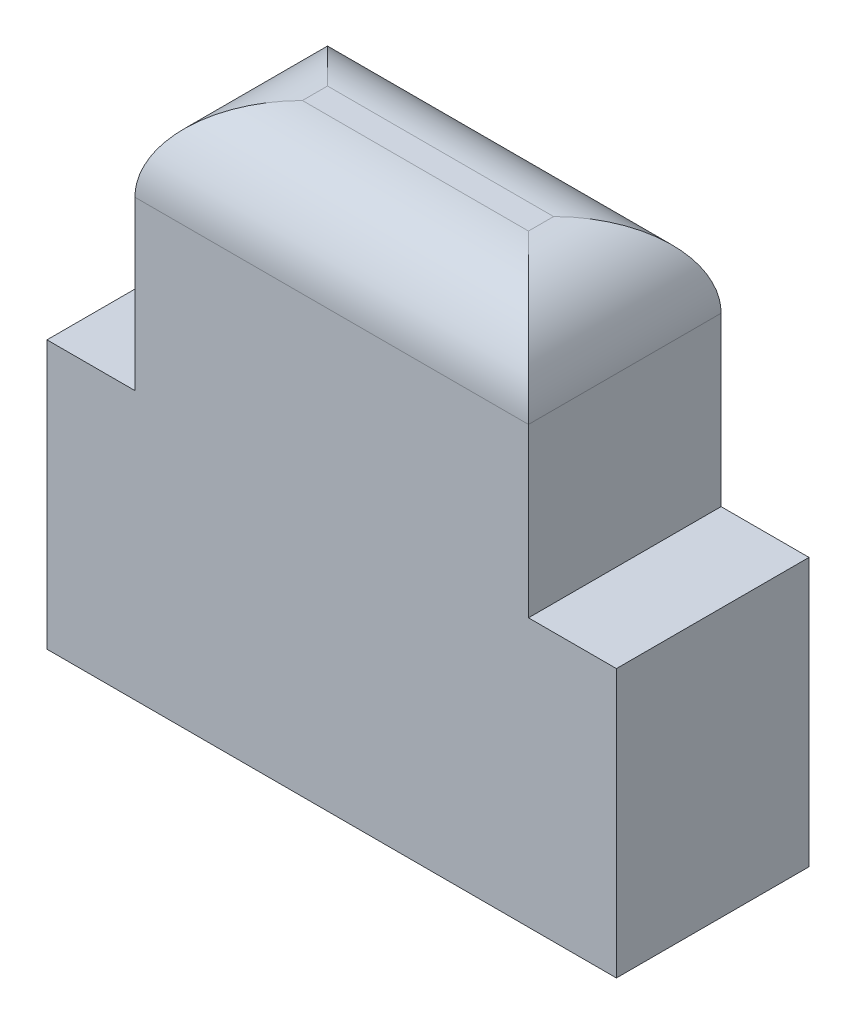
ISO-10303-21;
HEADER;
FILE_DESCRIPTION(('STEP AP214'),'2;1');
FILE_NAME('part.step','',(''),(''),'','','');
FILE_SCHEMA(('AUTOMOTIVE_DESIGN { 1 0 10303 214 1 1 1 1 }'));
ENDSEC;
DATA;
#1=APPLICATION_CONTEXT('core data for automotive mechanical design processes');
#2=APPLICATION_PROTOCOL_DEFINITION('international standard','automotive_design',2000,#1);
#3=PRODUCT_CONTEXT('',#1,'mechanical');
#4=PRODUCT('Part','Part','',(#3));
#5=PRODUCT_RELATED_PRODUCT_CATEGORY('part','',(#4));
#6=PRODUCT_DEFINITION_FORMATION('','',#4);
#7=PRODUCT_DEFINITION_CONTEXT('part definition',#1,'design');
#8=PRODUCT_DEFINITION('design','',#6,#7);
#9=PRODUCT_DEFINITION_SHAPE('','',#8);
#10=(LENGTH_UNIT() NAMED_UNIT(*) SI_UNIT(.MILLI.,.METRE.));
#11=(NAMED_UNIT(*) PLANE_ANGLE_UNIT() SI_UNIT($,.RADIAN.));
#12=(NAMED_UNIT(*) SI_UNIT($,.STERADIAN.) SOLID_ANGLE_UNIT());
#13=UNCERTAINTY_MEASURE_WITH_UNIT(LENGTH_MEASURE(1.E-05),#10,'distance_accuracy_value','');
#14=(GEOMETRIC_REPRESENTATION_CONTEXT(3) GLOBAL_UNCERTAINTY_ASSIGNED_CONTEXT((#13)) GLOBAL_UNIT_ASSIGNED_CONTEXT((#10,
#11,#12)) REPRESENTATION_CONTEXT('',''));
#15=CARTESIAN_POINT('',(0.,0.,0.));
#16=DIRECTION('',(0.,0.,1.));
#17=DIRECTION('',(1.,0.,0.));
#18=AXIS2_PLACEMENT_3D('',#15,#16,#17);
#19=CARTESIAN_POINT('',(0.,3.2,0.));
#20=DIRECTION('',(0.,1.,0.));
#21=DIRECTION('',(0.,0.,1.));
#22=AXIS2_PLACEMENT_3D('',#19,#20,#21);
#23=PLANE('',#22);
#24=DIRECTION('',(0.,0.,-1.));
#25=VECTOR('',#24,1.);
#26=CARTESIAN_POINT('',(2.35,3.2,1.15));
#27=LINE('',#26,#25);
#28=CARTESIAN_POINT('',(2.35,3.2,1.15));
#29=VERTEX_POINT('',#28);
#30=CARTESIAN_POINT('',(2.35,3.2,-1.15));
#31=VERTEX_POINT('',#30);
#32=EDGE_CURVE('E135',#29,#31,#27,.T.);
#33=ORIENTED_EDGE('',*,*,#32,.F.);
#34=DIRECTION('',(1.,0.,0.));
#35=VECTOR('',#34,1.);
#36=CARTESIAN_POINT('',(-3.4,3.2,1.15));
#37=LINE('',#36,#35);
#38=CARTESIAN_POINT('',(3.4,3.2,1.15));
#39=VERTEX_POINT('',#38);
#40=EDGE_CURVE('E131',#29,#39,#37,.T.);
#41=ORIENTED_EDGE('',*,*,#40,.T.);
#42=DIRECTION('',(0.,0.,-1.));
#43=VECTOR('',#42,1.);
#44=CARTESIAN_POINT('',(3.4,3.2,-1.15));
#45=LINE('',#44,#43);
#46=CARTESIAN_POINT('',(3.4,3.2,-1.15));
#47=VERTEX_POINT('',#46);
#48=EDGE_CURVE('E145',#39,#47,#45,.T.);
#49=ORIENTED_EDGE('',*,*,#48,.T.);
#50=DIRECTION('',(-1.,0.,0.));
#51=VECTOR('',#50,1.);
#52=CARTESIAN_POINT('',(-3.4,3.2,-1.15));
#53=LINE('',#52,#51);
#54=EDGE_CURVE('E150',#47,#31,#53,.T.);
#55=ORIENTED_EDGE('',*,*,#54,.T.);
#56=EDGE_LOOP('',(#33,#41,#49,#55));
#57=FACE_BOUND('',#56,.T.);
#58=ADVANCED_FACE('F35',(#57),#23,.T.);
#59=CARTESIAN_POINT('',(3.4,3.2,-1.15));
#60=DIRECTION('',(-1.,0.,0.));
#61=DIRECTION('',(0.,0.,1.));
#62=AXIS2_PLACEMENT_3D('',#59,#60,#61);
#63=PLANE('',#62);
#64=DIRECTION('',(0.,0.,-1.));
#65=VECTOR('',#64,1.);
#66=CARTESIAN_POINT('',(3.4,0.,-1.15));
#67=LINE('',#66,#65);
#68=CARTESIAN_POINT('',(3.4,0.,1.15));
#69=VERTEX_POINT('',#68);
#70=CARTESIAN_POINT('',(3.4,0.,-1.15));
#71=VERTEX_POINT('',#70);
#72=EDGE_CURVE('E144',#69,#71,#67,.T.);
#73=ORIENTED_EDGE('',*,*,#72,.T.);
#74=DIRECTION('',(0.,-1.,0.));
#75=VECTOR('',#74,1.);
#76=CARTESIAN_POINT('',(3.4,3.2,-1.15));
#77=LINE('',#76,#75);
#78=EDGE_CURVE('E168',#47,#71,#77,.T.);
#79=ORIENTED_EDGE('',*,*,#78,.F.);
#80=ORIENTED_EDGE('',*,*,#48,.F.);
#81=DIRECTION('',(0.,-1.,0.));
#82=VECTOR('',#81,1.);
#83=CARTESIAN_POINT('',(3.4,3.2,1.15));
#84=LINE('',#83,#82);
#85=EDGE_CURVE('E130',#39,#69,#84,.T.);
#86=ORIENTED_EDGE('',*,*,#85,.T.);
#87=EDGE_LOOP('',(#73,#79,#80,#86));
#88=FACE_BOUND('',#87,.T.);
#89=ADVANCED_FACE('F221',(#88),#63,.F.);
#90=CARTESIAN_POINT('',(-3.4,3.2,-1.15));
#91=DIRECTION('',(0.,0.,1.));
#92=DIRECTION('',(1.,0.,0.));
#93=AXIS2_PLACEMENT_3D('',#90,#91,#92);
#94=PLANE('',#93);
#95=DIRECTION('',(0.,-1.,0.));
#96=VECTOR('',#95,1.);
#97=CARTESIAN_POINT('',(-2.35,6.2,-1.15));
#98=LINE('',#97,#96);
#99=CARTESIAN_POINT('',(-2.35,5.2,-1.15));
#100=VERTEX_POINT('',#99);
#101=CARTESIAN_POINT('',(-2.35,3.2,-1.15));
#102=VERTEX_POINT('',#101);
#103=EDGE_CURVE('E119',#100,#102,#98,.T.);
#104=ORIENTED_EDGE('',*,*,#103,.F.);
#105=DIRECTION('',(-1.,0.,0.));
#106=VECTOR('',#105,1.);
#107=CARTESIAN_POINT('',(-3.4,5.2,-1.15));
#108=LINE('',#107,#106);
#109=CARTESIAN_POINT('',(2.35,5.2,-1.15));
#110=VERTEX_POINT('',#109);
#111=EDGE_CURVE('E180',#100,#110,#108,.F.);
#112=ORIENTED_EDGE('',*,*,#111,.T.);
#113=DIRECTION('',(0.,-1.,0.));
#114=VECTOR('',#113,1.);
#115=CARTESIAN_POINT('',(2.35,6.2,-1.15));
#116=LINE('',#115,#114);
#117=EDGE_CURVE('E142',#110,#31,#116,.T.);
#118=ORIENTED_EDGE('',*,*,#117,.T.);
#119=ORIENTED_EDGE('',*,*,#54,.F.);
#120=ORIENTED_EDGE('',*,*,#78,.T.);
#121=DIRECTION('',(-1.,0.,0.));
#122=VECTOR('',#121,1.);
#123=CARTESIAN_POINT('',(-3.4,0.,-1.15));
#124=LINE('',#123,#122);
#125=CARTESIAN_POINT('',(-3.4,0.,-1.15));
#126=VERTEX_POINT('',#125);
#127=EDGE_CURVE('E156',#71,#126,#124,.T.);
#128=ORIENTED_EDGE('',*,*,#127,.T.);
#129=DIRECTION('',(0.,-1.,0.));
#130=VECTOR('',#129,1.);
#131=CARTESIAN_POINT('',(-3.4,3.2,-1.15));
#132=LINE('',#131,#130);
#133=CARTESIAN_POINT('',(-3.4,3.2,-1.15));
#134=VERTEX_POINT('',#133);
#135=EDGE_CURVE('E165',#134,#126,#132,.T.);
#136=ORIENTED_EDGE('',*,*,#135,.F.);
#137=EDGE_CURVE('E148',#102,#134,#53,.T.);
#138=ORIENTED_EDGE('',*,*,#137,.F.);
#139=EDGE_LOOP('',(#104,#112,#118,#119,#120,#128,#136,#138));
#140=FACE_BOUND('',#139,.T.);
#141=ADVANCED_FACE('F205',(#140),#94,.F.);
#142=CARTESIAN_POINT('',(-3.4,3.2,-1.15));
#143=DIRECTION('',(1.,0.,0.));
#144=DIRECTION('',(0.,0.,-1.));
#145=AXIS2_PLACEMENT_3D('',#142,#143,#144);
#146=PLANE('',#145);
#147=DIRECTION('',(0.,0.,1.));
#148=VECTOR('',#147,1.);
#149=CARTESIAN_POINT('',(-3.4,0.,-1.15));
#150=LINE('',#149,#148);
#151=CARTESIAN_POINT('',(-3.4,0.,1.15));
#152=VERTEX_POINT('',#151);
#153=EDGE_CURVE('E158',#126,#152,#150,.T.);
#154=ORIENTED_EDGE('',*,*,#153,.T.);
#155=DIRECTION('',(0.,-1.,0.));
#156=VECTOR('',#155,1.);
#157=CARTESIAN_POINT('',(-3.4,3.2,1.15));
#158=LINE('',#157,#156);
#159=CARTESIAN_POINT('',(-3.4,3.2,1.15));
#160=VERTEX_POINT('',#159);
#161=EDGE_CURVE('E163',#160,#152,#158,.T.);
#162=ORIENTED_EDGE('',*,*,#161,.F.);
#163=DIRECTION('',(0.,0.,1.));
#164=VECTOR('',#163,1.);
#165=CARTESIAN_POINT('',(-3.4,3.2,-1.15));
#166=LINE('',#165,#164);
#167=EDGE_CURVE('E128',#134,#160,#166,.T.);
#168=ORIENTED_EDGE('',*,*,#167,.F.);
#169=ORIENTED_EDGE('',*,*,#135,.T.);
#170=EDGE_LOOP('',(#154,#162,#168,#169));
#171=FACE_BOUND('',#170,.T.);
#172=ADVANCED_FACE('F239',(#171),#146,.F.);
#173=CARTESIAN_POINT('',(-3.4,3.2,1.15));
#174=DIRECTION('',(0.,0.,-1.));
#175=DIRECTION('',(-1.,0.,0.));
#176=AXIS2_PLACEMENT_3D('',#173,#174,#175);
#177=PLANE('',#176);
#178=DIRECTION('',(0.,-1.,0.));
#179=VECTOR('',#178,1.);
#180=CARTESIAN_POINT('',(2.35,6.2,1.15));
#181=LINE('',#180,#179);
#182=CARTESIAN_POINT('',(2.35,5.2,1.15));
#183=VERTEX_POINT('',#182);
#184=EDGE_CURVE('E120',#183,#29,#181,.T.);
#185=ORIENTED_EDGE('',*,*,#184,.F.);
#186=DIRECTION('',(1.,0.,0.));
#187=VECTOR('',#186,1.);
#188=CARTESIAN_POINT('',(-3.4,5.2,1.15));
#189=LINE('',#188,#187);
#190=CARTESIAN_POINT('',(-2.35,5.2,1.15));
#191=VERTEX_POINT('',#190);
#192=EDGE_CURVE('E44',#183,#191,#189,.F.);
#193=ORIENTED_EDGE('',*,*,#192,.T.);
#194=DIRECTION('',(0.,-1.,0.));
#195=VECTOR('',#194,1.);
#196=CARTESIAN_POINT('',(-2.35,6.2,1.15));
#197=LINE('',#196,#195);
#198=CARTESIAN_POINT('',(-2.35,3.2,1.15));
#199=VERTEX_POINT('',#198);
#200=EDGE_CURVE('E111',#191,#199,#197,.T.);
#201=ORIENTED_EDGE('',*,*,#200,.T.);
#202=EDGE_CURVE('E115',#160,#199,#37,.T.);
#203=ORIENTED_EDGE('',*,*,#202,.F.);
#204=ORIENTED_EDGE('',*,*,#161,.T.);
#205=DIRECTION('',(1.,0.,0.));
#206=VECTOR('',#205,1.);
#207=CARTESIAN_POINT('',(-3.4,0.,1.15));
#208=LINE('',#207,#206);
#209=EDGE_CURVE('E149',#152,#69,#208,.T.);
#210=ORIENTED_EDGE('',*,*,#209,.T.);
#211=ORIENTED_EDGE('',*,*,#85,.F.);
#212=ORIENTED_EDGE('',*,*,#40,.F.);
#213=EDGE_LOOP('',(#185,#193,#201,#203,#204,#210,#211,#212));
#214=FACE_BOUND('',#213,.T.);
#215=ADVANCED_FACE('F113',(#214),#177,.F.);
#216=DIRECTION('',(0.,0.,1.));
#217=VECTOR('',#216,1.);
#218=CARTESIAN_POINT('',(-2.35,3.2,1.15));
#219=LINE('',#218,#217);
#220=EDGE_CURVE('E125',#102,#199,#219,.T.);
#221=ORIENTED_EDGE('',*,*,#220,.F.);
#222=ORIENTED_EDGE('',*,*,#137,.T.);
#223=ORIENTED_EDGE('',*,*,#167,.T.);
#224=ORIENTED_EDGE('',*,*,#202,.T.);
#225=EDGE_LOOP('',(#221,#222,#223,#224));
#226=FACE_BOUND('',#225,.T.);
#227=ADVANCED_FACE('F124',(#226),#23,.T.);
#228=CARTESIAN_POINT('',(0.,0.,0.));
#229=DIRECTION('',(0.,1.,0.));
#230=DIRECTION('',(0.,0.,1.));
#231=AXIS2_PLACEMENT_3D('',#228,#229,#230);
#232=PLANE('',#231);
#233=ORIENTED_EDGE('',*,*,#72,.F.);
#234=ORIENTED_EDGE('',*,*,#209,.F.);
#235=ORIENTED_EDGE('',*,*,#153,.F.);
#236=ORIENTED_EDGE('',*,*,#127,.F.);
#237=EDGE_LOOP('',(#233,#234,#235,#236));
#238=FACE_BOUND('',#237,.T.);
#239=ADVANCED_FACE('F233',(#238),#232,.F.);
#240=CARTESIAN_POINT('',(2.35,6.2,1.15));
#241=DIRECTION('',(-1.,0.,0.));
#242=DIRECTION('',(0.,0.,1.));
#243=AXIS2_PLACEMENT_3D('',#240,#241,#242);
#244=PLANE('',#243);
#245=ORIENTED_EDGE('',*,*,#117,.F.);
#246=DIRECTION('',(0.,0.,-1.));
#247=VECTOR('',#246,1.);
#248=CARTESIAN_POINT('',(2.35,5.2,1.15));
#249=LINE('',#248,#247);
#250=EDGE_CURVE('E59',#110,#183,#249,.F.);
#251=ORIENTED_EDGE('',*,*,#250,.T.);
#252=ORIENTED_EDGE('',*,*,#184,.T.);
#253=ORIENTED_EDGE('',*,*,#32,.T.);
#254=EDGE_LOOP('',(#245,#251,#252,#253));
#255=FACE_BOUND('',#254,.T.);
#256=ADVANCED_FACE('F218',(#255),#244,.F.);
#257=CARTESIAN_POINT('',(-2.35,6.2,1.15));
#258=DIRECTION('',(1.,0.,0.));
#259=DIRECTION('',(0.,0.,-1.));
#260=AXIS2_PLACEMENT_3D('',#257,#258,#259);
#261=PLANE('',#260);
#262=ORIENTED_EDGE('',*,*,#200,.F.);
#263=DIRECTION('',(0.,0.,1.));
#264=VECTOR('',#263,1.);
#265=CARTESIAN_POINT('',(-2.35,5.2,1.15));
#266=LINE('',#265,#264);
#267=EDGE_CURVE('E11',#191,#100,#266,.F.);
#268=ORIENTED_EDGE('',*,*,#267,.T.);
#269=ORIENTED_EDGE('',*,*,#103,.T.);
#270=ORIENTED_EDGE('',*,*,#220,.T.);
#271=EDGE_LOOP('',(#262,#268,#269,#270));
#272=FACE_BOUND('',#271,.T.);
#273=ADVANCED_FACE('F133',(#272),#261,.F.);
#274=CARTESIAN_POINT('',(0.,6.2,0.));
#275=DIRECTION('',(0.,-1.,0.));
#276=DIRECTION('',(0.,0.,-1.));
#277=AXIS2_PLACEMENT_3D('',#274,#275,#276);
#278=PLANE('',#277);
#279=DIRECTION('',(0.,0.,-1.));
#280=VECTOR('',#279,1.);
#281=CARTESIAN_POINT('',(1.35,6.2,0.));
#282=LINE('',#281,#280);
#283=CARTESIAN_POINT('',(1.35,6.2,0.15));
#284=VERTEX_POINT('',#283);
#285=CARTESIAN_POINT('',(1.35,6.2,-0.15));
#286=VERTEX_POINT('',#285);
#287=EDGE_CURVE('E175',#284,#286,#282,.T.);
#288=ORIENTED_EDGE('',*,*,#287,.T.);
#289=DIRECTION('',(-1.,0.,0.));
#290=VECTOR('',#289,1.);
#291=CARTESIAN_POINT('',(0.,6.2,-0.15));
#292=LINE('',#291,#290);
#293=CARTESIAN_POINT('',(-1.35,6.2,-0.15));
#294=VERTEX_POINT('',#293);
#295=EDGE_CURVE('E177',#286,#294,#292,.T.);
#296=ORIENTED_EDGE('',*,*,#295,.T.);
#297=DIRECTION('',(0.,0.,1.));
#298=VECTOR('',#297,1.);
#299=CARTESIAN_POINT('',(-1.35,6.2,0.));
#300=LINE('',#299,#298);
#301=CARTESIAN_POINT('',(-1.35,6.2,0.15));
#302=VERTEX_POINT('',#301);
#303=EDGE_CURVE('E171',#294,#302,#300,.T.);
#304=ORIENTED_EDGE('',*,*,#303,.T.);
#305=DIRECTION('',(1.,0.,0.));
#306=VECTOR('',#305,1.);
#307=CARTESIAN_POINT('',(0.,6.2,0.15));
#308=LINE('',#307,#306);
#309=EDGE_CURVE('E173',#302,#284,#308,.T.);
#310=ORIENTED_EDGE('',*,*,#309,.T.);
#311=EDGE_LOOP('',(#288,#296,#304,#310));
#312=FACE_BOUND('',#311,.T.);
#313=ADVANCED_FACE('F211',(#312),#278,.F.);
#314=CARTESIAN_POINT('',(0.,5.2,0.15));
#315=DIRECTION('',(1.,0.,0.));
#316=DIRECTION('',(0.,0.,-1.));
#317=AXIS2_PLACEMENT_3D('',#314,#315,#316);
#318=CYLINDRICAL_SURFACE('',#317,1.);
#319=CARTESIAN_POINT('',(-1.35,5.2,0.15));
#320=DIRECTION('',(0.707106781186547,0.,0.707106781186547));
#321=DIRECTION('',(-0.707106781186547,0.,0.707106781186547));
#322=AXIS2_PLACEMENT_3D('',#319,#320,#321);
#323=ELLIPSE('',#322,1.41421356237309,1.);
#324=EDGE_CURVE('E188',#191,#302,#323,.F.);
#325=ORIENTED_EDGE('',*,*,#324,.F.);
#326=ORIENTED_EDGE('',*,*,#192,.F.);
#327=CARTESIAN_POINT('',(1.35,5.2,0.15));
#328=DIRECTION('',(0.707106781186547,0.,-0.707106781186547));
#329=DIRECTION('',(0.707106781186547,0.,0.707106781186547));
#330=AXIS2_PLACEMENT_3D('',#327,#328,#329);
#331=ELLIPSE('',#330,1.41421356237309,1.);
#332=EDGE_CURVE('E39',#284,#183,#331,.T.);
#333=ORIENTED_EDGE('',*,*,#332,.F.);
#334=ORIENTED_EDGE('',*,*,#309,.F.);
#335=EDGE_LOOP('',(#325,#326,#333,#334));
#336=FACE_BOUND('',#335,.T.);
#337=ADVANCED_FACE('F37',(#336),#318,.T.);
#338=CARTESIAN_POINT('',(1.35,5.2,0.));
#339=DIRECTION('',(0.,0.,-1.));
#340=DIRECTION('',(-1.,0.,0.));
#341=AXIS2_PLACEMENT_3D('',#338,#339,#340);
#342=CYLINDRICAL_SURFACE('',#341,1.);
#343=ORIENTED_EDGE('',*,*,#332,.T.);
#344=ORIENTED_EDGE('',*,*,#250,.F.);
#345=CARTESIAN_POINT('',(1.35,5.2,-0.15));
#346=DIRECTION('',(-0.707106781186547,0.,-0.707106781186547));
#347=DIRECTION('',(0.707106781186547,0.,-0.707106781186547));
#348=AXIS2_PLACEMENT_3D('',#345,#346,#347);
#349=ELLIPSE('',#348,1.41421356237309,1.);
#350=EDGE_CURVE('E187',#286,#110,#349,.T.);
#351=ORIENTED_EDGE('',*,*,#350,.F.);
#352=ORIENTED_EDGE('',*,*,#287,.F.);
#353=EDGE_LOOP('',(#343,#344,#351,#352));
#354=FACE_BOUND('',#353,.T.);
#355=ADVANCED_FACE('F197',(#354),#342,.T.);
#356=CARTESIAN_POINT('',(-1.35,5.2,0.));
#357=DIRECTION('',(0.,0.,1.));
#358=DIRECTION('',(1.,0.,0.));
#359=AXIS2_PLACEMENT_3D('',#356,#357,#358);
#360=CYLINDRICAL_SURFACE('',#359,1.);
#361=ORIENTED_EDGE('',*,*,#324,.T.);
#362=ORIENTED_EDGE('',*,*,#303,.F.);
#363=CARTESIAN_POINT('',(-1.35,5.2,-0.15));
#364=DIRECTION('',(-0.707106781186547,0.,0.707106781186547));
#365=DIRECTION('',(0.707106781186547,0.,0.707106781186547));
#366=AXIS2_PLACEMENT_3D('',#363,#364,#365);
#367=ELLIPSE('',#366,1.41421356237309,1.);
#368=EDGE_CURVE('E185',#100,#294,#367,.F.);
#369=ORIENTED_EDGE('',*,*,#368,.F.);
#370=ORIENTED_EDGE('',*,*,#267,.F.);
#371=EDGE_LOOP('',(#361,#362,#369,#370));
#372=FACE_BOUND('',#371,.T.);
#373=ADVANCED_FACE('F202',(#372),#360,.T.);
#374=CARTESIAN_POINT('',(0.,5.2,-0.15));
#375=DIRECTION('',(-1.,0.,0.));
#376=DIRECTION('',(0.,0.,1.));
#377=AXIS2_PLACEMENT_3D('',#374,#375,#376);
#378=CYLINDRICAL_SURFACE('',#377,1.);
#379=ORIENTED_EDGE('',*,*,#350,.T.);
#380=ORIENTED_EDGE('',*,*,#111,.F.);
#381=ORIENTED_EDGE('',*,*,#368,.T.);
#382=ORIENTED_EDGE('',*,*,#295,.F.);
#383=EDGE_LOOP('',(#379,#380,#381,#382));
#384=FACE_BOUND('',#383,.T.);
#385=ADVANCED_FACE('F208',(#384),#378,.T.);
#386=CLOSED_SHELL('',(#58,#89,#141,#172,#215,#227,#239,#256,#273,#313,#337,#355,#373,#385));
#387=MANIFOLD_SOLID_BREP('B2',#386);
#388=ADVANCED_BREP_SHAPE_REPRESENTATION('',(#18,#387),#14);
#389=SHAPE_DEFINITION_REPRESENTATION(#9,#388);
ENDSEC;
END-ISO-10303-21;
